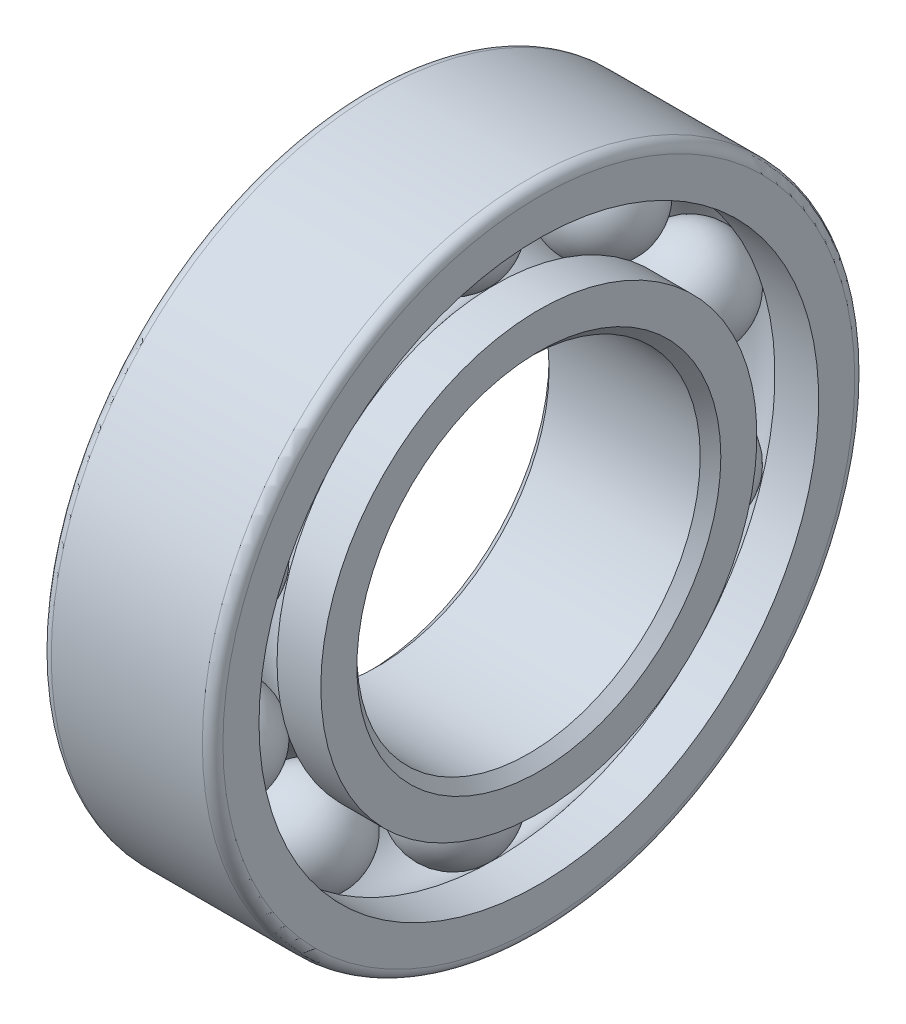
ISO-10303-21;
HEADER;
FILE_DESCRIPTION(('STEP AP214'),'2;1');
FILE_NAME('part.step','',(''),(''),'','','');
FILE_SCHEMA(('AUTOMOTIVE_DESIGN { 1 0 10303 214 1 1 1 1 }'));
ENDSEC;
DATA;
#1=APPLICATION_CONTEXT('core data for automotive mechanical design processes');
#2=APPLICATION_PROTOCOL_DEFINITION('international standard','automotive_design',2000,#1);
#3=PRODUCT_CONTEXT('',#1,'mechanical');
#4=PRODUCT('Part','Part','',(#3));
#5=PRODUCT_RELATED_PRODUCT_CATEGORY('part','',(#4));
#6=PRODUCT_DEFINITION_FORMATION('','',#4);
#7=PRODUCT_DEFINITION_CONTEXT('part definition',#1,'design');
#8=PRODUCT_DEFINITION('design','',#6,#7);
#9=PRODUCT_DEFINITION_SHAPE('','',#8);
#10=(LENGTH_UNIT() NAMED_UNIT(*) SI_UNIT(.MILLI.,.METRE.));
#11=(NAMED_UNIT(*) PLANE_ANGLE_UNIT() SI_UNIT($,.RADIAN.));
#12=(NAMED_UNIT(*) SI_UNIT($,.STERADIAN.) SOLID_ANGLE_UNIT());
#13=UNCERTAINTY_MEASURE_WITH_UNIT(LENGTH_MEASURE(1.E-05),#10,'distance_accuracy_value','');
#14=(GEOMETRIC_REPRESENTATION_CONTEXT(3) GLOBAL_UNCERTAINTY_ASSIGNED_CONTEXT((#13)) GLOBAL_UNIT_ASSIGNED_CONTEXT((#10,
#11,#12)) REPRESENTATION_CONTEXT('',''));
#15=CARTESIAN_POINT('',(0.,0.,0.));
#16=DIRECTION('',(0.,0.,1.));
#17=DIRECTION('',(1.,0.,0.));
#18=AXIS2_PLACEMENT_3D('',#15,#16,#17);
#19=CARTESIAN_POINT('',(0.,5.86537320921842,4.26144307912035));
#20=DIRECTION('',(-1.,0.,0.));
#21=DIRECTION('',(0.,0.809016994374955,0.587785252292462));
#22=AXIS2_PLACEMENT_3D('',#19,#20,#21);
#23=SPHERICAL_SURFACE('',#22,1.5);
#24=CARTESIAN_POINT('',(-1.5,5.86537320921842,4.26144307912035));
#25=VERTEX_POINT('',#24);
#26=VERTEX_LOOP('',#25);
#27=FACE_BOUND('',#26,.T.);
#28=ADVANCED_FACE('F37',(#27),#23,.T.);
#29=CLOSED_SHELL('',(#28));
#30=MANIFOLD_SOLID_BREP('B2',#29);
#31=CARTESIAN_POINT('',(0.,2.24037320921845,6.89515974313984));
#32=DIRECTION('',(-1.,0.,0.));
#33=DIRECTION('',(0.,0.309016994374958,0.95105651629515));
#34=AXIS2_PLACEMENT_3D('',#31,#32,#33);
#35=SPHERICAL_SURFACE('',#34,1.5);
#36=CARTESIAN_POINT('',(-1.5,2.24037320921845,6.89515974313984));
#37=VERTEX_POINT('',#36);
#38=VERTEX_LOOP('',#37);
#39=FACE_BOUND('',#38,.T.);
#40=ADVANCED_FACE('F55',(#39),#35,.T.);
#41=CLOSED_SHELL('',(#40));
#42=MANIFOLD_SOLID_BREP('B6',#41);
#43=CARTESIAN_POINT('',(0.,-2.2403732092183,6.89515974313989));
#44=DIRECTION('',(-1.,0.,0.));
#45=DIRECTION('',(0.,-0.309016994374938,0.951056516295157));
#46=AXIS2_PLACEMENT_3D('',#43,#44,#45);
#47=SPHERICAL_SURFACE('',#46,1.5);
#48=CARTESIAN_POINT('',(-1.5,-2.2403732092183,6.89515974313989));
#49=VERTEX_POINT('',#48);
#50=VERTEX_LOOP('',#49);
#51=FACE_BOUND('',#50,.T.);
#52=ADVANCED_FACE('F73',(#51),#47,.T.);
#53=CLOSED_SHELL('',(#52));
#54=MANIFOLD_SOLID_BREP('B33',#53);
#55=CARTESIAN_POINT('',(0.,-5.86537320921833,4.26144307912048));
#56=DIRECTION('',(-1.,0.,0.));
#57=DIRECTION('',(0.,-0.809016994374942,0.58778525229248));
#58=AXIS2_PLACEMENT_3D('',#55,#56,#57);
#59=SPHERICAL_SURFACE('',#58,1.5);
#60=CARTESIAN_POINT('',(-1.5,-5.86537320921833,4.26144307912048));
#61=VERTEX_POINT('',#60);
#62=VERTEX_LOOP('',#61);
#63=FACE_BOUND('',#62,.T.);
#64=ADVANCED_FACE('F91',(#63),#59,.T.);
#65=CLOSED_SHELL('',(#64));
#66=MANIFOLD_SOLID_BREP('B51',#65);
#67=CARTESIAN_POINT('',(0.,-7.25,0.));
#68=DIRECTION('',(-1.,0.,0.));
#69=DIRECTION('',(0.,-1.,0.));
#70=AXIS2_PLACEMENT_3D('',#67,#68,#69);
#71=SPHERICAL_SURFACE('',#70,1.5);
#72=CARTESIAN_POINT('',(-1.5,-7.25,0.));
#73=VERTEX_POINT('',#72);
#74=VERTEX_LOOP('',#73);
#75=FACE_BOUND('',#74,.T.);
#76=ADVANCED_FACE('F109',(#75),#71,.T.);
#77=CLOSED_SHELL('',(#76));
#78=MANIFOLD_SOLID_BREP('B69',#77);
#79=CARTESIAN_POINT('',(0.,-5.86537320921839,-4.2614430791204));
#80=DIRECTION('',(-1.,0.,0.));
#81=DIRECTION('',(0.,-0.809016994374951,-0.587785252292469));
#82=AXIS2_PLACEMENT_3D('',#79,#80,#81);
#83=SPHERICAL_SURFACE('',#82,1.5);
#84=CARTESIAN_POINT('',(-1.5,-5.86537320921839,-4.2614430791204));
#85=VERTEX_POINT('',#84);
#86=VERTEX_LOOP('',#85);
#87=FACE_BOUND('',#86,.T.);
#88=ADVANCED_FACE('F127',(#87),#83,.T.);
#89=CLOSED_SHELL('',(#88));
#90=MANIFOLD_SOLID_BREP('B87',#89);
#91=CARTESIAN_POINT('',(0.,-2.2403732092184,-6.89515974313986));
#92=DIRECTION('',(-1.,0.,0.));
#93=DIRECTION('',(0.,-0.309016994374952,-0.951056516295152));
#94=AXIS2_PLACEMENT_3D('',#91,#92,#93);
#95=SPHERICAL_SURFACE('',#94,1.5);
#96=CARTESIAN_POINT('',(-1.5,-2.2403732092184,-6.89515974313986));
#97=VERTEX_POINT('',#96);
#98=VERTEX_LOOP('',#97);
#99=FACE_BOUND('',#98,.T.);
#100=ADVANCED_FACE('F145',(#99),#95,.T.);
#101=CLOSED_SHELL('',(#100));
#102=MANIFOLD_SOLID_BREP('B105',#101);
#103=CARTESIAN_POINT('',(0.,2.24037320921835,-6.89515974313987));
#104=DIRECTION('',(-1.,0.,0.));
#105=DIRECTION('',(0.,0.309016994374945,-0.951056516295155));
#106=AXIS2_PLACEMENT_3D('',#103,#104,#105);
#107=SPHERICAL_SURFACE('',#106,1.5);
#108=CARTESIAN_POINT('',(-1.5,2.24037320921835,-6.89515974313987));
#109=VERTEX_POINT('',#108);
#110=VERTEX_LOOP('',#109);
#111=FACE_BOUND('',#110,.T.);
#112=ADVANCED_FACE('F163',(#111),#107,.T.);
#113=CLOSED_SHELL('',(#112));
#114=MANIFOLD_SOLID_BREP('B123',#113);
#115=CARTESIAN_POINT('',(0.,5.86537320921836,-4.26144307912044));
#116=DIRECTION('',(-1.,0.,0.));
#117=DIRECTION('',(0.,0.809016994374947,-0.587785252292474));
#118=AXIS2_PLACEMENT_3D('',#115,#116,#117);
#119=SPHERICAL_SURFACE('',#118,1.5);
#120=CARTESIAN_POINT('',(-1.5,5.86537320921836,-4.26144307912044));
#121=VERTEX_POINT('',#120);
#122=VERTEX_LOOP('',#121);
#123=FACE_BOUND('',#122,.T.);
#124=ADVANCED_FACE('F181',(#123),#119,.T.);
#125=CLOSED_SHELL('',(#124));
#126=MANIFOLD_SOLID_BREP('B141',#125);
#127=CARTESIAN_POINT('',(0.,7.25,0.));
#128=DIRECTION('',(-1.,0.,0.));
#129=DIRECTION('',(0.,1.,0.));
#130=AXIS2_PLACEMENT_3D('',#127,#128,#129);
#131=SPHERICAL_SURFACE('',#130,1.5);
#132=CARTESIAN_POINT('',(-1.5,7.25,0.));
#133=VERTEX_POINT('',#132);
#134=VERTEX_LOOP('',#133);
#135=FACE_BOUND('',#134,.T.);
#136=ADVANCED_FACE('F201',(#135),#131,.T.);
#137=CLOSED_SHELL('',(#136));
#138=MANIFOLD_SOLID_BREP('B159',#137);
#139=CARTESIAN_POINT('',(0.,0.,0.));
#140=DIRECTION('',(-1.,0.,0.));
#141=DIRECTION('',(0.,0.,1.));
#142=AXIS2_PLACEMENT_3D('',#139,#140,#141);
#143=TOROIDAL_SURFACE('',#142,7.25,1.52055080502946);
#144=CARTESIAN_POINT('',(1.22559159212021,0.,0.));
#145=DIRECTION('',(-1.,0.,0.));
#146=DIRECTION('',(0.,0.,1.));
#147=AXIS2_PLACEMENT_3D('',#144,#145,#146);
#148=CIRCLE('',#147,6.35);
#149=CARTESIAN_POINT('',(1.22559159212021,0.,6.35));
#150=VERTEX_POINT('',#149);
#151=EDGE_CURVE('E249',#150,#150,#148,.T.);
#152=ORIENTED_EDGE('',*,*,#151,.T.);
#153=EDGE_LOOP('',(#152));
#154=FACE_BOUND('',#153,.T.);
#155=CARTESIAN_POINT('',(-1.22559159212021,0.,0.));
#156=DIRECTION('',(-1.,0.,0.));
#157=DIRECTION('',(0.,0.,1.));
#158=AXIS2_PLACEMENT_3D('',#155,#156,#157);
#159=CIRCLE('',#158,6.35);
#160=CARTESIAN_POINT('',(-1.22559159212021,0.,6.35));
#161=VERTEX_POINT('',#160);
#162=EDGE_CURVE('E240',#161,#161,#159,.T.);
#163=ORIENTED_EDGE('',*,*,#162,.F.);
#164=EDGE_LOOP('',(#163));
#165=FACE_BOUND('',#164,.T.);
#166=ADVANCED_FACE('F220',(#154,#165),#143,.F.);
#167=CARTESIAN_POINT('',(-10.301724137931,0.,0.));
#168=DIRECTION('',(-1.,0.,0.));
#169=DIRECTION('',(0.,0.,1.));
#170=AXIS2_PLACEMENT_3D('',#167,#168,#169);
#171=CYLINDRICAL_SURFACE('',#170,6.35);
#172=CARTESIAN_POINT('',(-2.5,0.,0.));
#173=DIRECTION('',(-1.,0.,0.));
#174=DIRECTION('',(0.,0.,1.));
#175=AXIS2_PLACEMENT_3D('',#172,#173,#174);
#176=CIRCLE('',#175,6.35);
#177=CARTESIAN_POINT('',(-2.5,0.,6.35));
#178=VERTEX_POINT('',#177);
#179=EDGE_CURVE('E243',#178,#178,#176,.T.);
#180=ORIENTED_EDGE('',*,*,#179,.F.);
#181=EDGE_LOOP('',(#180));
#182=FACE_BOUND('',#181,.T.);
#183=ORIENTED_EDGE('',*,*,#162,.T.);
#184=EDGE_LOOP('',(#183));
#185=FACE_BOUND('',#184,.T.);
#186=ADVANCED_FACE('F261',(#182,#185),#171,.T.);
#187=CARTESIAN_POINT('',(-2.5,0.,0.));
#188=DIRECTION('',(1.,0.,0.));
#189=DIRECTION('',(0.,0.,-1.));
#190=AXIS2_PLACEMENT_3D('',#187,#188,#189);
#191=PLANE('',#190);
#192=CARTESIAN_POINT('',(-2.5,0.,0.));
#193=DIRECTION('',(1.,0.,0.));
#194=DIRECTION('',(0.,0.,-1.));
#195=AXIS2_PLACEMENT_3D('',#192,#193,#194);
#196=CIRCLE('',#195,5.3);
#197=CARTESIAN_POINT('',(-2.5,0.,-5.3));
#198=VERTEX_POINT('',#197);
#199=EDGE_CURVE('E200',#198,#198,#196,.T.);
#200=ORIENTED_EDGE('',*,*,#199,.T.);
#201=EDGE_LOOP('',(#200));
#202=FACE_BOUND('',#201,.T.);
#203=ORIENTED_EDGE('',*,*,#179,.T.);
#204=EDGE_LOOP('',(#203));
#205=FACE_BOUND('',#204,.T.);
#206=ADVANCED_FACE('F271',(#202,#205),#191,.F.);
#207=CARTESIAN_POINT('',(-10.301724137931,0.,0.));
#208=DIRECTION('',(-1.,0.,0.));
#209=DIRECTION('',(0.,0.,1.));
#210=AXIS2_PLACEMENT_3D('',#207,#208,#209);
#211=CYLINDRICAL_SURFACE('',#210,5.);
#212=CARTESIAN_POINT('',(2.2,0.,0.));
#213=DIRECTION('',(1.,0.,0.));
#214=DIRECTION('',(0.,0.,-1.));
#215=AXIS2_PLACEMENT_3D('',#212,#213,#214);
#216=CIRCLE('',#215,5.);
#217=CARTESIAN_POINT('',(2.2,0.,-5.));
#218=VERTEX_POINT('',#217);
#219=EDGE_CURVE('E227',#218,#218,#216,.T.);
#220=ORIENTED_EDGE('',*,*,#219,.T.);
#221=EDGE_LOOP('',(#220));
#222=FACE_BOUND('',#221,.T.);
#223=CARTESIAN_POINT('',(-2.2,0.,0.));
#224=DIRECTION('',(1.,0.,0.));
#225=DIRECTION('',(0.,0.,-1.));
#226=AXIS2_PLACEMENT_3D('',#223,#224,#225);
#227=CIRCLE('',#226,5.);
#228=CARTESIAN_POINT('',(-2.2,0.,-5.));
#229=VERTEX_POINT('',#228);
#230=EDGE_CURVE('E231',#229,#229,#227,.F.);
#231=ORIENTED_EDGE('',*,*,#230,.T.);
#232=EDGE_LOOP('',(#231));
#233=FACE_BOUND('',#232,.T.);
#234=ADVANCED_FACE('F265',(#222,#233),#211,.F.);
#235=CARTESIAN_POINT('',(2.5,0.,0.));
#236=DIRECTION('',(1.,0.,0.));
#237=DIRECTION('',(0.,0.,-1.));
#238=AXIS2_PLACEMENT_3D('',#235,#236,#237);
#239=PLANE('',#238);
#240=CARTESIAN_POINT('',(2.5,0.,0.));
#241=DIRECTION('',(1.,0.,0.));
#242=DIRECTION('',(0.,0.,-1.));
#243=AXIS2_PLACEMENT_3D('',#240,#241,#242);
#244=CIRCLE('',#243,5.3);
#245=CARTESIAN_POINT('',(2.5,0.,-5.3));
#246=VERTEX_POINT('',#245);
#247=EDGE_CURVE('E235',#246,#246,#244,.F.);
#248=ORIENTED_EDGE('',*,*,#247,.T.);
#249=EDGE_LOOP('',(#248));
#250=FACE_BOUND('',#249,.T.);
#251=CARTESIAN_POINT('',(2.5,0.,0.));
#252=DIRECTION('',(-1.,0.,0.));
#253=DIRECTION('',(0.,0.,1.));
#254=AXIS2_PLACEMENT_3D('',#251,#252,#253);
#255=CIRCLE('',#254,6.35);
#256=CARTESIAN_POINT('',(2.5,0.,6.35));
#257=VERTEX_POINT('',#256);
#258=EDGE_CURVE('E246',#257,#257,#255,.T.);
#259=ORIENTED_EDGE('',*,*,#258,.F.);
#260=EDGE_LOOP('',(#259));
#261=FACE_BOUND('',#260,.T.);
#262=ADVANCED_FACE('F259',(#250,#261),#239,.T.);
#263=ORIENTED_EDGE('',*,*,#151,.F.);
#264=EDGE_LOOP('',(#263));
#265=FACE_BOUND('',#264,.T.);
#266=ORIENTED_EDGE('',*,*,#258,.T.);
#267=EDGE_LOOP('',(#266));
#268=FACE_BOUND('',#267,.T.);
#269=ADVANCED_FACE('F255',(#265,#268),#171,.T.);
#270=CARTESIAN_POINT('',(2.5,0.,0.));
#271=DIRECTION('',(1.,0.,0.));
#272=DIRECTION('',(0.,0.,-1.));
#273=AXIS2_PLACEMENT_3D('',#270,#271,#272);
#274=CONICAL_SURFACE('',#273,5.3,0.785398163397447);
#275=ORIENTED_EDGE('',*,*,#219,.F.);
#276=EDGE_LOOP('',(#275));
#277=FACE_BOUND('',#276,.T.);
#278=ORIENTED_EDGE('',*,*,#247,.F.);
#279=EDGE_LOOP('',(#278));
#280=FACE_BOUND('',#279,.T.);
#281=ADVANCED_FACE('F258',(#277,#280),#274,.F.);
#282=CARTESIAN_POINT('',(-2.2,0.,0.));
#283=DIRECTION('',(-1.,0.,0.));
#284=DIRECTION('',(0.,0.,1.));
#285=AXIS2_PLACEMENT_3D('',#282,#283,#284);
#286=CONICAL_SURFACE('',#285,5.,0.78539816339745);
#287=ORIENTED_EDGE('',*,*,#199,.F.);
#288=EDGE_LOOP('',(#287));
#289=FACE_BOUND('',#288,.T.);
#290=ORIENTED_EDGE('',*,*,#230,.F.);
#291=EDGE_LOOP('',(#290));
#292=FACE_BOUND('',#291,.T.);
#293=ADVANCED_FACE('F222',(#289,#292),#286,.F.);
#294=CLOSED_SHELL('',(#166,#186,#206,#234,#262,#269,#281,#293));
#295=MANIFOLD_SOLID_BREP('B177',#294);
#296=CARTESIAN_POINT('',(0.,0.,0.));
#297=DIRECTION('',(-1.,0.,0.));
#298=DIRECTION('',(0.,0.,1.));
#299=AXIS2_PLACEMENT_3D('',#296,#297,#298);
#300=TOROIDAL_SURFACE('',#299,7.25,1.52055080502946);
#301=CARTESIAN_POINT('',(-1.22559159212021,0.,0.));
#302=DIRECTION('',(-1.,0.,0.));
#303=DIRECTION('',(0.,0.,1.));
#304=AXIS2_PLACEMENT_3D('',#301,#302,#303);
#305=CIRCLE('',#304,8.15);
#306=CARTESIAN_POINT('',(-1.22559159212021,0.,8.15));
#307=VERTEX_POINT('',#306);
#308=EDGE_CURVE('E369',#307,#307,#305,.T.);
#309=ORIENTED_EDGE('',*,*,#308,.T.);
#310=EDGE_LOOP('',(#309));
#311=FACE_BOUND('',#310,.T.);
#312=CARTESIAN_POINT('',(1.22559159212021,0.,0.));
#313=DIRECTION('',(-1.,0.,0.));
#314=DIRECTION('',(0.,0.,1.));
#315=AXIS2_PLACEMENT_3D('',#312,#313,#314);
#316=CIRCLE('',#315,8.15);
#317=CARTESIAN_POINT('',(1.22559159212021,0.,8.15));
#318=VERTEX_POINT('',#317);
#319=EDGE_CURVE('E360',#318,#318,#316,.T.);
#320=ORIENTED_EDGE('',*,*,#319,.F.);
#321=EDGE_LOOP('',(#320));
#322=FACE_BOUND('',#321,.T.);
#323=ADVANCED_FACE('F340',(#311,#322),#300,.F.);
#324=CARTESIAN_POINT('',(-10.301724137931,0.,0.));
#325=DIRECTION('',(-1.,0.,0.));
#326=DIRECTION('',(0.,0.,1.));
#327=AXIS2_PLACEMENT_3D('',#324,#325,#326);
#328=CYLINDRICAL_SURFACE('',#327,8.15);
#329=ORIENTED_EDGE('',*,*,#319,.T.);
#330=EDGE_LOOP('',(#329));
#331=FACE_BOUND('',#330,.T.);
#332=CARTESIAN_POINT('',(2.5,0.,0.));
#333=DIRECTION('',(-1.,0.,0.));
#334=DIRECTION('',(0.,0.,1.));
#335=AXIS2_PLACEMENT_3D('',#332,#333,#334);
#336=CIRCLE('',#335,8.15);
#337=CARTESIAN_POINT('',(2.5,0.,8.15));
#338=VERTEX_POINT('',#337);
#339=EDGE_CURVE('E363',#338,#338,#336,.T.);
#340=ORIENTED_EDGE('',*,*,#339,.F.);
#341=EDGE_LOOP('',(#340));
#342=FACE_BOUND('',#341,.T.);
#343=ADVANCED_FACE('F381',(#331,#342),#328,.F.);
#344=CARTESIAN_POINT('',(2.5,0.,0.));
#345=DIRECTION('',(1.,0.,0.));
#346=DIRECTION('',(0.,0.,-1.));
#347=AXIS2_PLACEMENT_3D('',#344,#345,#346);
#348=PLANE('',#347);
#349=CARTESIAN_POINT('',(2.5,0.,0.));
#350=DIRECTION('',(1.,0.,0.));
#351=DIRECTION('',(0.,0.,-1.));
#352=AXIS2_PLACEMENT_3D('',#349,#350,#351);
#353=CIRCLE('',#352,9.2);
#354=CARTESIAN_POINT('',(2.5,0.,-9.2));
#355=VERTEX_POINT('',#354);
#356=EDGE_CURVE('E347',#355,#355,#353,.T.);
#357=ORIENTED_EDGE('',*,*,#356,.T.);
#358=EDGE_LOOP('',(#357));
#359=FACE_BOUND('',#358,.T.);
#360=ORIENTED_EDGE('',*,*,#339,.T.);
#361=EDGE_LOOP('',(#360));
#362=FACE_BOUND('',#361,.T.);
#363=ADVANCED_FACE('F390',(#359,#362),#348,.T.);
#364=CARTESIAN_POINT('',(-10.301724137931,0.,0.));
#365=DIRECTION('',(-1.,0.,0.));
#366=DIRECTION('',(0.,0.,1.));
#367=AXIS2_PLACEMENT_3D('',#364,#365,#366);
#368=CYLINDRICAL_SURFACE('',#367,9.5);
#369=CARTESIAN_POINT('',(2.2,0.,0.));
#370=DIRECTION('',(1.,0.,0.));
#371=DIRECTION('',(0.,0.,-1.));
#372=AXIS2_PLACEMENT_3D('',#369,#370,#371);
#373=CIRCLE('',#372,9.5);
#374=CARTESIAN_POINT('',(2.2,0.,-9.5));
#375=VERTEX_POINT('',#374);
#376=EDGE_CURVE('E351',#375,#375,#373,.F.);
#377=ORIENTED_EDGE('',*,*,#376,.T.);
#378=EDGE_LOOP('',(#377));
#379=FACE_BOUND('',#378,.T.);
#380=CARTESIAN_POINT('',(-2.2,0.,0.));
#381=DIRECTION('',(1.,0.,0.));
#382=DIRECTION('',(0.,0.,-1.));
#383=AXIS2_PLACEMENT_3D('',#380,#381,#382);
#384=CIRCLE('',#383,9.5);
#385=CARTESIAN_POINT('',(-2.2,0.,-9.5));
#386=VERTEX_POINT('',#385);
#387=EDGE_CURVE('E355',#386,#386,#384,.T.);
#388=ORIENTED_EDGE('',*,*,#387,.T.);
#389=EDGE_LOOP('',(#388));
#390=FACE_BOUND('',#389,.T.);
#391=ADVANCED_FACE('F387',(#379,#390),#368,.T.);
#392=CARTESIAN_POINT('',(-2.5,0.,0.));
#393=DIRECTION('',(1.,0.,0.));
#394=DIRECTION('',(0.,0.,-1.));
#395=AXIS2_PLACEMENT_3D('',#392,#393,#394);
#396=PLANE('',#395);
#397=CARTESIAN_POINT('',(-2.5,0.,0.));
#398=DIRECTION('',(1.,0.,0.));
#399=DIRECTION('',(0.,0.,-1.));
#400=AXIS2_PLACEMENT_3D('',#397,#398,#399);
#401=CIRCLE('',#400,9.2);
#402=CARTESIAN_POINT('',(-2.5,0.,-9.2));
#403=VERTEX_POINT('',#402);
#404=EDGE_CURVE('E219',#403,#403,#401,.F.);
#405=ORIENTED_EDGE('',*,*,#404,.T.);
#406=EDGE_LOOP('',(#405));
#407=FACE_BOUND('',#406,.T.);
#408=CARTESIAN_POINT('',(-2.5,0.,0.));
#409=DIRECTION('',(-1.,0.,0.));
#410=DIRECTION('',(0.,0.,1.));
#411=AXIS2_PLACEMENT_3D('',#408,#409,#410);
#412=CIRCLE('',#411,8.15);
#413=CARTESIAN_POINT('',(-2.5,0.,8.15));
#414=VERTEX_POINT('',#413);
#415=EDGE_CURVE('E366',#414,#414,#412,.T.);
#416=ORIENTED_EDGE('',*,*,#415,.F.);
#417=EDGE_LOOP('',(#416));
#418=FACE_BOUND('',#417,.T.);
#419=ADVANCED_FACE('F378',(#407,#418),#396,.F.);
#420=ORIENTED_EDGE('',*,*,#415,.T.);
#421=EDGE_LOOP('',(#420));
#422=FACE_BOUND('',#421,.T.);
#423=ORIENTED_EDGE('',*,*,#308,.F.);
#424=EDGE_LOOP('',(#423));
#425=FACE_BOUND('',#424,.T.);
#426=ADVANCED_FACE('F375',(#422,#425),#328,.F.);
#427=CARTESIAN_POINT('',(2.2,0.,0.));
#428=DIRECTION('',(1.,0.,0.));
#429=DIRECTION('',(0.,0.,-1.));
#430=AXIS2_PLACEMENT_3D('',#427,#428,#429);
#431=TOROIDAL_SURFACE('',#430,9.2,0.3);
#432=ORIENTED_EDGE('',*,*,#356,.F.);
#433=EDGE_LOOP('',(#432));
#434=FACE_BOUND('',#433,.T.);
#435=ORIENTED_EDGE('',*,*,#376,.F.);
#436=EDGE_LOOP('',(#435));
#437=FACE_BOUND('',#436,.T.);
#438=ADVANCED_FACE('F377',(#434,#437),#431,.T.);
#439=CARTESIAN_POINT('',(-2.2,0.,0.));
#440=DIRECTION('',(1.,0.,0.));
#441=DIRECTION('',(0.,0.,-1.));
#442=AXIS2_PLACEMENT_3D('',#439,#440,#441);
#443=TOROIDAL_SURFACE('',#442,9.2,0.3);
#444=ORIENTED_EDGE('',*,*,#387,.F.);
#445=EDGE_LOOP('',(#444));
#446=FACE_BOUND('',#445,.T.);
#447=ORIENTED_EDGE('',*,*,#404,.F.);
#448=EDGE_LOOP('',(#447));
#449=FACE_BOUND('',#448,.T.);
#450=ADVANCED_FACE('F342',(#446,#449),#443,.T.);
#451=CLOSED_SHELL('',(#323,#343,#363,#391,#419,#426,#438,#450));
#452=MANIFOLD_SOLID_BREP('B195',#451);
#453=ADVANCED_BREP_SHAPE_REPRESENTATION('',(#18,#30,#42,#54,#66,#78,#90,#102,#114,#126,#138,
#295,#452),#14);
#454=SHAPE_DEFINITION_REPRESENTATION(#9,#453);
ENDSEC;
END-ISO-10303-21;
